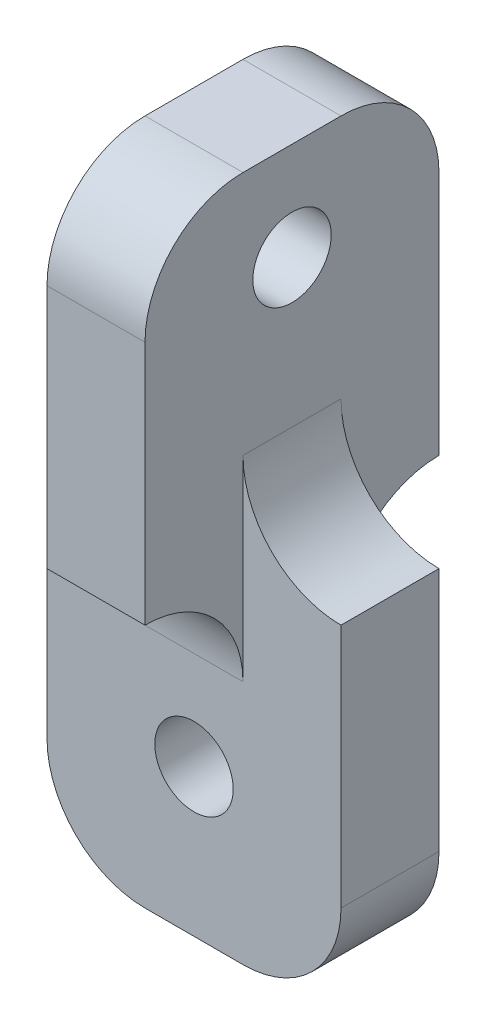
ISO-10303-21;
HEADER;
FILE_DESCRIPTION(('STEP AP214'),'2;1');
FILE_NAME('part.step','',(''),(''),'','','');
FILE_SCHEMA(('AUTOMOTIVE_DESIGN { 1 0 10303 214 1 1 1 1 }'));
ENDSEC;
DATA;
#1=APPLICATION_CONTEXT('core data for automotive mechanical design processes');
#2=APPLICATION_PROTOCOL_DEFINITION('international standard','automotive_design',2000,#1);
#3=PRODUCT_CONTEXT('',#1,'mechanical');
#4=PRODUCT('Part','Part','',(#3));
#5=PRODUCT_RELATED_PRODUCT_CATEGORY('part','',(#4));
#6=PRODUCT_DEFINITION_FORMATION('','',#4);
#7=PRODUCT_DEFINITION_CONTEXT('part definition',#1,'design');
#8=PRODUCT_DEFINITION('design','',#6,#7);
#9=PRODUCT_DEFINITION_SHAPE('','',#8);
#10=(LENGTH_UNIT() NAMED_UNIT(*) SI_UNIT(.MILLI.,.METRE.));
#11=(NAMED_UNIT(*) PLANE_ANGLE_UNIT() SI_UNIT($,.RADIAN.));
#12=(NAMED_UNIT(*) SI_UNIT($,.STERADIAN.) SOLID_ANGLE_UNIT());
#13=UNCERTAINTY_MEASURE_WITH_UNIT(LENGTH_MEASURE(1.E-05),#10,'distance_accuracy_value','');
#14=(GEOMETRIC_REPRESENTATION_CONTEXT(3) GLOBAL_UNCERTAINTY_ASSIGNED_CONTEXT((#13)) GLOBAL_UNIT_ASSIGNED_CONTEXT((#10,
#11,#12)) REPRESENTATION_CONTEXT('',''));
#15=CARTESIAN_POINT('',(0.,0.,0.));
#16=DIRECTION('',(0.,0.,1.));
#17=DIRECTION('',(1.,0.,0.));
#18=AXIS2_PLACEMENT_3D('',#15,#16,#17);
#19=CARTESIAN_POINT('',(-20.,25.,10.));
#20=DIRECTION('',(1.,0.,0.));
#21=DIRECTION('',(0.,0.,-1.));
#22=AXIS2_PLACEMENT_3D('',#19,#20,#21);
#23=CYLINDRICAL_SURFACE('',#22,10.);
#24=DIRECTION('',(-1.,0.,0.));
#25=VECTOR('',#24,1.);
#26=CARTESIAN_POINT('',(-20.,25.,20.));
#27=LINE('',#26,#25);
#28=CARTESIAN_POINT('',(-10.,25.,20.));
#29=VERTEX_POINT('',#28);
#30=CARTESIAN_POINT('',(-20.,25.,20.));
#31=VERTEX_POINT('',#30);
#32=EDGE_CURVE('E219',#29,#31,#27,.T.);
#33=ORIENTED_EDGE('',*,*,#32,.F.);
#34=CARTESIAN_POINT('',(-10.,25.,10.));
#35=DIRECTION('',(-1.,0.,0.));
#36=DIRECTION('',(0.,0.,1.));
#37=AXIS2_PLACEMENT_3D('',#34,#35,#36);
#38=CIRCLE('',#37,10.);
#39=CARTESIAN_POINT('',(-10.,35.,10.));
#40=VERTEX_POINT('',#39);
#41=EDGE_CURVE('E153',#40,#29,#38,.F.);
#42=ORIENTED_EDGE('',*,*,#41,.F.);
#43=DIRECTION('',(-1.,0.,0.));
#44=VECTOR('',#43,1.);
#45=CARTESIAN_POINT('',(-20.,35.,10.));
#46=LINE('',#45,#44);
#47=CARTESIAN_POINT('',(-20.,35.,10.));
#48=VERTEX_POINT('',#47);
#49=EDGE_CURVE('E216',#48,#40,#46,.F.);
#50=ORIENTED_EDGE('',*,*,#49,.F.);
#51=CARTESIAN_POINT('',(-20.,25.,10.));
#52=DIRECTION('',(-1.,0.,0.));
#53=DIRECTION('',(0.,0.,1.));
#54=AXIS2_PLACEMENT_3D('',#51,#52,#53);
#55=CIRCLE('',#54,10.);
#56=EDGE_CURVE('E211',#31,#48,#55,.T.);
#57=ORIENTED_EDGE('',*,*,#56,.F.);
#58=EDGE_LOOP('',(#33,#42,#50,#57));
#59=FACE_BOUND('',#58,.T.);
#60=ADVANCED_FACE('F33',(#59),#23,.T.);
#61=CARTESIAN_POINT('',(-20.,25.,0.));
#62=DIRECTION('',(1.,0.,0.));
#63=DIRECTION('',(0.,0.,-1.));
#64=AXIS2_PLACEMENT_3D('',#61,#62,#63);
#65=CYLINDRICAL_SURFACE('',#64,10.);
#66=DIRECTION('',(1.,0.,0.));
#67=VECTOR('',#66,1.);
#68=CARTESIAN_POINT('',(-20.,25.,-10.));
#69=LINE('',#68,#67);
#70=CARTESIAN_POINT('',(-20.,25.,-10.));
#71=VERTEX_POINT('',#70);
#72=CARTESIAN_POINT('',(-10.,25.,-10.));
#73=VERTEX_POINT('',#72);
#74=EDGE_CURVE('E229',#71,#73,#69,.T.);
#75=ORIENTED_EDGE('',*,*,#74,.F.);
#76=CARTESIAN_POINT('',(-20.,25.,0.));
#77=DIRECTION('',(-1.,0.,0.));
#78=DIRECTION('',(0.,0.,1.));
#79=AXIS2_PLACEMENT_3D('',#76,#77,#78);
#80=CIRCLE('',#79,10.);
#81=CARTESIAN_POINT('',(-20.,35.,0.));
#82=VERTEX_POINT('',#81);
#83=EDGE_CURVE('E224',#82,#71,#80,.T.);
#84=ORIENTED_EDGE('',*,*,#83,.F.);
#85=DIRECTION('',(1.,0.,0.));
#86=VECTOR('',#85,1.);
#87=CARTESIAN_POINT('',(0.,35.,0.));
#88=LINE('',#87,#86);
#89=CARTESIAN_POINT('',(-10.,35.,0.));
#90=VERTEX_POINT('',#89);
#91=EDGE_CURVE('E226',#90,#82,#88,.F.);
#92=ORIENTED_EDGE('',*,*,#91,.F.);
#93=CARTESIAN_POINT('',(-10.,25.,0.));
#94=DIRECTION('',(-1.,0.,0.));
#95=DIRECTION('',(0.,0.,1.));
#96=AXIS2_PLACEMENT_3D('',#93,#94,#95);
#97=CIRCLE('',#96,10.);
#98=EDGE_CURVE('E221',#73,#90,#97,.F.);
#99=ORIENTED_EDGE('',*,*,#98,.F.);
#100=EDGE_LOOP('',(#75,#84,#92,#99));
#101=FACE_BOUND('',#100,.T.);
#102=ADVANCED_FACE('F309',(#101),#65,.T.);
#103=CARTESIAN_POINT('',(-10.,-25.,10.));
#104=DIRECTION('',(0.,0.,1.));
#105=DIRECTION('',(1.,0.,0.));
#106=AXIS2_PLACEMENT_3D('',#103,#104,#105);
#107=CYLINDRICAL_SURFACE('',#106,10.);
#108=DIRECTION('',(0.,0.,1.));
#109=VECTOR('',#108,1.);
#110=CARTESIAN_POINT('',(-10.,-35.,10.));
#111=LINE('',#110,#109);
#112=CARTESIAN_POINT('',(-9.99999999999999,-35.,0.));
#113=VERTEX_POINT('',#112);
#114=CARTESIAN_POINT('',(-9.99999999999999,-35.,10.));
#115=VERTEX_POINT('',#114);
#116=EDGE_CURVE('E242',#113,#115,#111,.T.);
#117=ORIENTED_EDGE('',*,*,#116,.F.);
#118=CARTESIAN_POINT('',(-10.,-25.,0.));
#119=DIRECTION('',(0.,0.,-1.));
#120=DIRECTION('',(-1.,0.,0.));
#121=AXIS2_PLACEMENT_3D('',#118,#119,#120);
#122=CIRCLE('',#121,10.);
#123=CARTESIAN_POINT('',(0.,-25.,0.));
#124=VERTEX_POINT('',#123);
#125=EDGE_CURVE('E237',#124,#113,#122,.T.);
#126=ORIENTED_EDGE('',*,*,#125,.F.);
#127=DIRECTION('',(0.,0.,1.));
#128=VECTOR('',#127,1.);
#129=CARTESIAN_POINT('',(0.,-25.,10.));
#130=LINE('',#129,#128);
#131=CARTESIAN_POINT('',(0.,-25.,10.));
#132=VERTEX_POINT('',#131);
#133=EDGE_CURVE('E239',#132,#124,#130,.F.);
#134=ORIENTED_EDGE('',*,*,#133,.F.);
#135=CARTESIAN_POINT('',(-10.,-25.,10.));
#136=DIRECTION('',(0.,0.,-1.));
#137=DIRECTION('',(-1.,0.,0.));
#138=AXIS2_PLACEMENT_3D('',#135,#136,#137);
#139=CIRCLE('',#138,10.);
#140=EDGE_CURVE('E232',#115,#132,#139,.F.);
#141=ORIENTED_EDGE('',*,*,#140,.F.);
#142=EDGE_LOOP('',(#117,#126,#134,#141));
#143=FACE_BOUND('',#142,.T.);
#144=ADVANCED_FACE('F315',(#143),#107,.T.);
#145=CARTESIAN_POINT('',(-20.,-25.,10.));
#146=DIRECTION('',(0.,0.,1.));
#147=DIRECTION('',(1.,0.,0.));
#148=AXIS2_PLACEMENT_3D('',#145,#146,#147);
#149=CYLINDRICAL_SURFACE('',#148,10.);
#150=DIRECTION('',(0.,0.,-1.));
#151=VECTOR('',#150,1.);
#152=CARTESIAN_POINT('',(-20.,-35.,10.));
#153=LINE('',#152,#151);
#154=CARTESIAN_POINT('',(-20.,-35.,10.));
#155=VERTEX_POINT('',#154);
#156=CARTESIAN_POINT('',(-20.,-35.,0.));
#157=VERTEX_POINT('',#156);
#158=EDGE_CURVE('E253',#155,#157,#153,.T.);
#159=ORIENTED_EDGE('',*,*,#158,.F.);
#160=CARTESIAN_POINT('',(-20.,-25.,10.));
#161=DIRECTION('',(0.,0.,-1.));
#162=DIRECTION('',(-1.,0.,0.));
#163=AXIS2_PLACEMENT_3D('',#160,#161,#162);
#164=CIRCLE('',#163,10.);
#165=CARTESIAN_POINT('',(-30.,-25.,10.));
#166=VERTEX_POINT('',#165);
#167=EDGE_CURVE('E247',#166,#155,#164,.F.);
#168=ORIENTED_EDGE('',*,*,#167,.F.);
#169=DIRECTION('',(0.,0.,-1.));
#170=VECTOR('',#169,1.);
#171=CARTESIAN_POINT('',(-30.,-25.,10.));
#172=LINE('',#171,#170);
#173=CARTESIAN_POINT('',(-30.,-25.,0.));
#174=VERTEX_POINT('',#173);
#175=EDGE_CURVE('E250',#174,#166,#172,.F.);
#176=ORIENTED_EDGE('',*,*,#175,.F.);
#177=CARTESIAN_POINT('',(-20.,-25.,0.));
#178=DIRECTION('',(0.,0.,-1.));
#179=DIRECTION('',(-1.,0.,0.));
#180=AXIS2_PLACEMENT_3D('',#177,#178,#179);
#181=CIRCLE('',#180,10.);
#182=EDGE_CURVE('E245',#157,#174,#181,.T.);
#183=ORIENTED_EDGE('',*,*,#182,.F.);
#184=EDGE_LOOP('',(#159,#168,#176,#183));
#185=FACE_BOUND('',#184,.T.);
#186=ADVANCED_FACE('F392',(#185),#149,.T.);
#187=CARTESIAN_POINT('',(0.,0.,10.));
#188=DIRECTION('',(1.,0.,0.));
#189=DIRECTION('',(0.,1.,0.));
#190=AXIS2_PLACEMENT_3D('',#187,#188,#189);
#191=PLANE('',#190);
#192=DIRECTION('',(0.,-1.,0.));
#193=VECTOR('',#192,1.);
#194=CARTESIAN_POINT('',(0.,0.,10.));
#195=LINE('',#194,#193);
#196=CARTESIAN_POINT('',(0.,0.,10.));
#197=VERTEX_POINT('',#196);
#198=EDGE_CURVE('E263',#197,#132,#195,.T.);
#199=ORIENTED_EDGE('',*,*,#198,.T.);
#200=ORIENTED_EDGE('',*,*,#133,.T.);
#201=DIRECTION('',(0.,-1.,0.));
#202=VECTOR('',#201,1.);
#203=CARTESIAN_POINT('',(0.,0.,0.));
#204=LINE('',#203,#202);
#205=CARTESIAN_POINT('',(0.,0.,0.));
#206=VERTEX_POINT('',#205);
#207=EDGE_CURVE('E266',#206,#124,#204,.T.);
#208=ORIENTED_EDGE('',*,*,#207,.F.);
#209=DIRECTION('',(0.,0.,-1.));
#210=VECTOR('',#209,1.);
#211=CARTESIAN_POINT('',(0.,0.,10.));
#212=LINE('',#211,#210);
#213=EDGE_CURVE('E256',#197,#206,#212,.T.);
#214=ORIENTED_EDGE('',*,*,#213,.F.);
#215=EDGE_LOOP('',(#199,#200,#208,#214));
#216=FACE_BOUND('',#215,.T.);
#217=ADVANCED_FACE('F338',(#216),#191,.T.);
#218=CARTESIAN_POINT('',(-30.,0.,10.));
#219=DIRECTION('',(1.,0.,0.));
#220=DIRECTION('',(0.,1.,0.));
#221=AXIS2_PLACEMENT_3D('',#218,#219,#220);
#222=PLANE('',#221);
#223=DIRECTION('',(0.,-1.,0.));
#224=VECTOR('',#223,1.);
#225=CARTESIAN_POINT('',(-30.,0.,0.));
#226=LINE('',#225,#224);
#227=CARTESIAN_POINT('',(-30.,0.,0.));
#228=VERTEX_POINT('',#227);
#229=EDGE_CURVE('E202',#228,#174,#226,.T.);
#230=ORIENTED_EDGE('',*,*,#229,.T.);
#231=ORIENTED_EDGE('',*,*,#175,.T.);
#232=DIRECTION('',(0.,-1.,0.));
#233=VECTOR('',#232,1.);
#234=CARTESIAN_POINT('',(-30.,0.,10.));
#235=LINE('',#234,#233);
#236=CARTESIAN_POINT('',(-30.,0.,10.));
#237=VERTEX_POINT('',#236);
#238=EDGE_CURVE('E259',#237,#166,#235,.T.);
#239=ORIENTED_EDGE('',*,*,#238,.F.);
#240=DIRECTION('',(0.,0.,-1.));
#241=VECTOR('',#240,1.);
#242=CARTESIAN_POINT('',(-30.,0.,10.));
#243=LINE('',#242,#241);
#244=EDGE_CURVE('E257',#237,#228,#243,.T.);
#245=ORIENTED_EDGE('',*,*,#244,.T.);
#246=EDGE_LOOP('',(#230,#231,#239,#245));
#247=FACE_BOUND('',#246,.T.);
#248=ADVANCED_FACE('F391',(#247),#222,.F.);
#249=CARTESIAN_POINT('',(0.,-35.,10.));
#250=DIRECTION('',(0.,-1.,0.));
#251=DIRECTION('',(0.,0.,-1.));
#252=AXIS2_PLACEMENT_3D('',#249,#250,#251);
#253=PLANE('',#252);
#254=DIRECTION('',(-1.,0.,0.));
#255=VECTOR('',#254,1.);
#256=CARTESIAN_POINT('',(0.,-35.,0.));
#257=LINE('',#256,#255);
#258=EDGE_CURVE('E264',#113,#157,#257,.T.);
#259=ORIENTED_EDGE('',*,*,#258,.F.);
#260=ORIENTED_EDGE('',*,*,#116,.T.);
#261=DIRECTION('',(-1.,0.,0.));
#262=VECTOR('',#261,1.);
#263=CARTESIAN_POINT('',(0.,-35.,10.));
#264=LINE('',#263,#262);
#265=EDGE_CURVE('E272',#115,#155,#264,.T.);
#266=ORIENTED_EDGE('',*,*,#265,.T.);
#267=ORIENTED_EDGE('',*,*,#158,.T.);
#268=EDGE_LOOP('',(#259,#260,#266,#267));
#269=FACE_BOUND('',#268,.T.);
#270=ADVANCED_FACE('F411',(#269),#253,.T.);
#271=CARTESIAN_POINT('',(0.,0.,10.));
#272=DIRECTION('',(0.,0.,-1.));
#273=DIRECTION('',(-1.,0.,0.));
#274=AXIS2_PLACEMENT_3D('',#271,#272,#273);
#275=PLANE('',#274);
#276=CARTESIAN_POINT('',(-15.,-20.,10.));
#277=DIRECTION('',(0.,0.,-1.));
#278=DIRECTION('',(-1.,0.,0.));
#279=AXIS2_PLACEMENT_3D('',#276,#277,#278);
#280=CIRCLE('',#279,4.);
#281=CARTESIAN_POINT('',(-19.,-20.,10.));
#282=VERTEX_POINT('',#281);
#283=EDGE_CURVE('E269',#282,#282,#280,.F.);
#284=ORIENTED_EDGE('',*,*,#283,.F.);
#285=EDGE_LOOP('',(#284));
#286=FACE_BOUND('',#285,.T.);
#287=DIRECTION('',(-1.,0.,0.));
#288=VECTOR('',#287,1.);
#289=CARTESIAN_POINT('',(-20.,-10.,10.));
#290=LINE('',#289,#288);
#291=CARTESIAN_POINT('',(-10.,-10.,10.));
#292=VERTEX_POINT('',#291);
#293=CARTESIAN_POINT('',(-20.,-10.,10.));
#294=VERTEX_POINT('',#293);
#295=EDGE_CURVE('E172',#292,#294,#290,.T.);
#296=ORIENTED_EDGE('',*,*,#295,.T.);
#297=DIRECTION('',(0.,1.,0.));
#298=VECTOR('',#297,1.);
#299=CARTESIAN_POINT('',(-20.,0.,10.));
#300=LINE('',#299,#298);
#301=CARTESIAN_POINT('',(-20.,10.,10.));
#302=VERTEX_POINT('',#301);
#303=EDGE_CURVE('E55',#294,#302,#300,.T.);
#304=ORIENTED_EDGE('',*,*,#303,.T.);
#305=CARTESIAN_POINT('',(-30.,10.,10.));
#306=DIRECTION('',(0.,0.,-1.));
#307=DIRECTION('',(-1.,0.,0.));
#308=AXIS2_PLACEMENT_3D('',#305,#306,#307);
#309=CIRCLE('',#308,10.);
#310=EDGE_CURVE('E11',#302,#237,#309,.T.);
#311=ORIENTED_EDGE('',*,*,#310,.T.);
#312=ORIENTED_EDGE('',*,*,#238,.T.);
#313=ORIENTED_EDGE('',*,*,#167,.T.);
#314=ORIENTED_EDGE('',*,*,#265,.F.);
#315=ORIENTED_EDGE('',*,*,#140,.T.);
#316=ORIENTED_EDGE('',*,*,#198,.F.);
#317=CARTESIAN_POINT('',(0.,10.,10.));
#318=DIRECTION('',(0.,0.,-1.));
#319=DIRECTION('',(-1.,0.,0.));
#320=AXIS2_PLACEMENT_3D('',#317,#318,#319);
#321=CIRCLE('',#320,10.);
#322=CARTESIAN_POINT('',(-10.,10.,10.));
#323=VERTEX_POINT('',#322);
#324=EDGE_CURVE('E192',#197,#323,#321,.T.);
#325=ORIENTED_EDGE('',*,*,#324,.T.);
#326=DIRECTION('',(0.,-1.,0.));
#327=VECTOR('',#326,1.);
#328=CARTESIAN_POINT('',(-10.,35.,10.));
#329=LINE('',#328,#327);
#330=EDGE_CURVE('E209',#323,#292,#329,.T.);
#331=ORIENTED_EDGE('',*,*,#330,.T.);
#332=EDGE_LOOP('',(#296,#304,#311,#312,#313,#314,#315,#316,#325,#331));
#333=FACE_BOUND('',#332,.T.);
#334=ADVANCED_FACE('F208',(#286,#333),#275,.F.);
#335=CARTESIAN_POINT('',(0.,0.,0.));
#336=DIRECTION('',(0.,0.,-1.));
#337=DIRECTION('',(-1.,0.,0.));
#338=AXIS2_PLACEMENT_3D('',#335,#336,#337);
#339=PLANE('',#338);
#340=CARTESIAN_POINT('',(-15.,-20.,0.));
#341=DIRECTION('',(0.,0.,1.));
#342=DIRECTION('',(1.,0.,0.));
#343=AXIS2_PLACEMENT_3D('',#340,#341,#342);
#344=CIRCLE('',#343,4.);
#345=CARTESIAN_POINT('',(-11.,-20.,0.));
#346=VERTEX_POINT('',#345);
#347=EDGE_CURVE('E157',#346,#346,#344,.T.);
#348=ORIENTED_EDGE('',*,*,#347,.T.);
#349=EDGE_LOOP('',(#348));
#350=FACE_BOUND('',#349,.T.);
#351=ORIENTED_EDGE('',*,*,#229,.F.);
#352=CARTESIAN_POINT('',(-30.,10.,0.));
#353=DIRECTION('',(0.,0.,-1.));
#354=DIRECTION('',(-1.,0.,0.));
#355=AXIS2_PLACEMENT_3D('',#352,#353,#354);
#356=CIRCLE('',#355,10.);
#357=CARTESIAN_POINT('',(-20.,10.,0.));
#358=VERTEX_POINT('',#357);
#359=EDGE_CURVE('E41',#228,#358,#356,.F.);
#360=ORIENTED_EDGE('',*,*,#359,.T.);
#361=DIRECTION('',(0.,-1.,0.));
#362=VECTOR('',#361,1.);
#363=CARTESIAN_POINT('',(-20.,35.,0.));
#364=LINE('',#363,#362);
#365=CARTESIAN_POINT('',(-20.,-10.,0.));
#366=VERTEX_POINT('',#365);
#367=EDGE_CURVE('E48',#358,#366,#364,.T.);
#368=ORIENTED_EDGE('',*,*,#367,.T.);
#369=DIRECTION('',(-1.,0.,0.));
#370=VECTOR('',#369,1.);
#371=CARTESIAN_POINT('',(0.,-10.,0.));
#372=LINE('',#371,#370);
#373=CARTESIAN_POINT('',(-10.,-10.,0.));
#374=VERTEX_POINT('',#373);
#375=EDGE_CURVE('E176',#366,#374,#372,.F.);
#376=ORIENTED_EDGE('',*,*,#375,.T.);
#377=DIRECTION('',(0.,1.,0.));
#378=VECTOR('',#377,1.);
#379=CARTESIAN_POINT('',(-10.,0.,0.));
#380=LINE('',#379,#378);
#381=CARTESIAN_POINT('',(-10.,10.,0.));
#382=VERTEX_POINT('',#381);
#383=EDGE_CURVE('E173',#374,#382,#380,.T.);
#384=ORIENTED_EDGE('',*,*,#383,.T.);
#385=CARTESIAN_POINT('',(0.,10.,0.));
#386=DIRECTION('',(0.,0.,-1.));
#387=DIRECTION('',(-1.,0.,0.));
#388=AXIS2_PLACEMENT_3D('',#385,#386,#387);
#389=CIRCLE('',#388,10.);
#390=EDGE_CURVE('E190',#382,#206,#389,.F.);
#391=ORIENTED_EDGE('',*,*,#390,.T.);
#392=ORIENTED_EDGE('',*,*,#207,.T.);
#393=ORIENTED_EDGE('',*,*,#125,.T.);
#394=ORIENTED_EDGE('',*,*,#258,.T.);
#395=ORIENTED_EDGE('',*,*,#182,.T.);
#396=EDGE_LOOP('',(#351,#360,#368,#376,#384,#391,#392,#393,#394,#395));
#397=FACE_BOUND('',#396,.T.);
#398=ADVANCED_FACE('F199',(#350,#397),#339,.T.);
#399=CARTESIAN_POINT('',(-15.,-20.,14.));
#400=DIRECTION('',(0.,0.,-1.));
#401=DIRECTION('',(-1.,0.,0.));
#402=AXIS2_PLACEMENT_3D('',#399,#400,#401);
#403=CYLINDRICAL_SURFACE('',#402,4.);
#404=ORIENTED_EDGE('',*,*,#347,.F.);
#405=EDGE_LOOP('',(#404));
#406=FACE_BOUND('',#405,.T.);
#407=ORIENTED_EDGE('',*,*,#283,.T.);
#408=EDGE_LOOP('',(#407));
#409=FACE_BOUND('',#408,.T.);
#410=ADVANCED_FACE('F306',(#406,#409),#403,.F.);
#411=CARTESIAN_POINT('',(-20.,35.,20.));
#412=DIRECTION('',(0.,0.,-1.));
#413=DIRECTION('',(-1.,0.,0.));
#414=AXIS2_PLACEMENT_3D('',#411,#412,#413);
#415=PLANE('',#414);
#416=DIRECTION('',(0.,-1.,0.));
#417=VECTOR('',#416,1.);
#418=CARTESIAN_POINT('',(-10.,35.,20.));
#419=LINE('',#418,#417);
#420=CARTESIAN_POINT('',(-10.,0.,20.));
#421=VERTEX_POINT('',#420);
#422=EDGE_CURVE('E145',#29,#421,#419,.T.);
#423=ORIENTED_EDGE('',*,*,#422,.F.);
#424=ORIENTED_EDGE('',*,*,#32,.T.);
#425=DIRECTION('',(0.,-1.,0.));
#426=VECTOR('',#425,1.);
#427=CARTESIAN_POINT('',(-20.,35.,20.));
#428=LINE('',#427,#426);
#429=CARTESIAN_POINT('',(-20.,0.,20.));
#430=VERTEX_POINT('',#429);
#431=EDGE_CURVE('E165',#31,#430,#428,.T.);
#432=ORIENTED_EDGE('',*,*,#431,.T.);
#433=DIRECTION('',(1.,0.,0.));
#434=VECTOR('',#433,1.);
#435=CARTESIAN_POINT('',(-20.,0.,20.));
#436=LINE('',#435,#434);
#437=EDGE_CURVE('E162',#430,#421,#436,.T.);
#438=ORIENTED_EDGE('',*,*,#437,.T.);
#439=EDGE_LOOP('',(#423,#424,#432,#438));
#440=FACE_BOUND('',#439,.T.);
#441=ADVANCED_FACE('F163',(#440),#415,.F.);
#442=CARTESIAN_POINT('',(-10.,35.,20.));
#443=DIRECTION('',(-1.,0.,0.));
#444=DIRECTION('',(0.,0.,1.));
#445=AXIS2_PLACEMENT_3D('',#442,#443,#444);
#446=PLANE('',#445);
#447=CARTESIAN_POINT('',(-10.,25.,5.));
#448=DIRECTION('',(1.,0.,0.));
#449=DIRECTION('',(0.,0.,-1.));
#450=AXIS2_PLACEMENT_3D('',#447,#448,#449);
#451=CIRCLE('',#450,4.);
#452=CARTESIAN_POINT('',(-10.,25.,1.));
#453=VERTEX_POINT('',#452);
#454=EDGE_CURVE('E235',#453,#453,#451,.T.);
#455=ORIENTED_EDGE('',*,*,#454,.F.);
#456=EDGE_LOOP('',(#455));
#457=FACE_BOUND('',#456,.T.);
#458=DIRECTION('',(0.,0.,-1.));
#459=VECTOR('',#458,1.);
#460=CARTESIAN_POINT('',(-10.,10.,0.));
#461=LINE('',#460,#459);
#462=EDGE_CURVE('E188',#323,#382,#461,.T.);
#463=ORIENTED_EDGE('',*,*,#462,.T.);
#464=ORIENTED_EDGE('',*,*,#383,.F.);
#465=CARTESIAN_POINT('',(-10.,-10.,-10.));
#466=DIRECTION('',(-1.,0.,0.));
#467=DIRECTION('',(0.,0.,1.));
#468=AXIS2_PLACEMENT_3D('',#465,#466,#467);
#469=CIRCLE('',#468,10.);
#470=CARTESIAN_POINT('',(-10.,0.,-10.));
#471=VERTEX_POINT('',#470);
#472=EDGE_CURVE('E186',#374,#471,#469,.T.);
#473=ORIENTED_EDGE('',*,*,#472,.T.);
#474=DIRECTION('',(0.,-1.,0.));
#475=VECTOR('',#474,1.);
#476=CARTESIAN_POINT('',(-10.,35.,-10.));
#477=LINE('',#476,#475);
#478=EDGE_CURVE('E158',#73,#471,#477,.T.);
#479=ORIENTED_EDGE('',*,*,#478,.F.);
#480=ORIENTED_EDGE('',*,*,#98,.T.);
#481=DIRECTION('',(0.,0.,-1.));
#482=VECTOR('',#481,1.);
#483=CARTESIAN_POINT('',(-10.,35.,20.));
#484=LINE('',#483,#482);
#485=EDGE_CURVE('E288',#40,#90,#484,.T.);
#486=ORIENTED_EDGE('',*,*,#485,.F.);
#487=ORIENTED_EDGE('',*,*,#41,.T.);
#488=ORIENTED_EDGE('',*,*,#422,.T.);
#489=CARTESIAN_POINT('',(-10.,-10.,20.));
#490=DIRECTION('',(-1.,0.,0.));
#491=DIRECTION('',(0.,0.,1.));
#492=AXIS2_PLACEMENT_3D('',#489,#490,#491);
#493=CIRCLE('',#492,10.);
#494=EDGE_CURVE('E150',#421,#292,#493,.T.);
#495=ORIENTED_EDGE('',*,*,#494,.T.);
#496=ORIENTED_EDGE('',*,*,#330,.F.);
#497=EDGE_LOOP('',(#463,#464,#473,#479,#480,#486,#487,#488,#495,#496));
#498=FACE_BOUND('',#497,.T.);
#499=ADVANCED_FACE('F148',(#457,#498),#446,.F.);
#500=CARTESIAN_POINT('',(-20.,35.,-10.));
#501=DIRECTION('',(0.,0.,-1.));
#502=DIRECTION('',(-1.,0.,0.));
#503=AXIS2_PLACEMENT_3D('',#500,#501,#502);
#504=PLANE('',#503);
#505=DIRECTION('',(0.,-1.,0.));
#506=VECTOR('',#505,1.);
#507=CARTESIAN_POINT('',(-20.,35.,-10.));
#508=LINE('',#507,#506);
#509=CARTESIAN_POINT('',(-20.,0.,-10.));
#510=VERTEX_POINT('',#509);
#511=EDGE_CURVE('E282',#71,#510,#508,.T.);
#512=ORIENTED_EDGE('',*,*,#511,.F.);
#513=ORIENTED_EDGE('',*,*,#74,.T.);
#514=ORIENTED_EDGE('',*,*,#478,.T.);
#515=DIRECTION('',(1.,0.,0.));
#516=VECTOR('',#515,1.);
#517=CARTESIAN_POINT('',(-20.,0.,-10.));
#518=LINE('',#517,#516);
#519=EDGE_CURVE('E167',#510,#471,#518,.T.);
#520=ORIENTED_EDGE('',*,*,#519,.F.);
#521=EDGE_LOOP('',(#512,#513,#514,#520));
#522=FACE_BOUND('',#521,.T.);
#523=ADVANCED_FACE('F298',(#522),#504,.T.);
#524=CARTESIAN_POINT('',(-20.,35.,20.));
#525=DIRECTION('',(-1.,0.,0.));
#526=DIRECTION('',(0.,0.,1.));
#527=AXIS2_PLACEMENT_3D('',#524,#525,#526);
#528=PLANE('',#527);
#529=CARTESIAN_POINT('',(-20.,25.,5.));
#530=DIRECTION('',(-1.,0.,0.));
#531=DIRECTION('',(0.,0.,1.));
#532=AXIS2_PLACEMENT_3D('',#529,#530,#531);
#533=CIRCLE('',#532,4.);
#534=CARTESIAN_POINT('',(-20.,25.,9.));
#535=VERTEX_POINT('',#534);
#536=EDGE_CURVE('E168',#535,#535,#533,.T.);
#537=ORIENTED_EDGE('',*,*,#536,.F.);
#538=EDGE_LOOP('',(#537));
#539=FACE_BOUND('',#538,.T.);
#540=ORIENTED_EDGE('',*,*,#367,.F.);
#541=DIRECTION('',(0.,0.,-1.));
#542=VECTOR('',#541,1.);
#543=CARTESIAN_POINT('',(-20.,10.,20.));
#544=LINE('',#543,#542);
#545=EDGE_CURVE('E195',#358,#302,#544,.F.);
#546=ORIENTED_EDGE('',*,*,#545,.T.);
#547=ORIENTED_EDGE('',*,*,#303,.F.);
#548=CARTESIAN_POINT('',(-20.,-10.,20.));
#549=DIRECTION('',(-1.,0.,0.));
#550=DIRECTION('',(0.,0.,1.));
#551=AXIS2_PLACEMENT_3D('',#548,#549,#550);
#552=CIRCLE('',#551,10.);
#553=EDGE_CURVE('E174',#294,#430,#552,.F.);
#554=ORIENTED_EDGE('',*,*,#553,.T.);
#555=ORIENTED_EDGE('',*,*,#431,.F.);
#556=ORIENTED_EDGE('',*,*,#56,.T.);
#557=DIRECTION('',(0.,0.,-1.));
#558=VECTOR('',#557,1.);
#559=CARTESIAN_POINT('',(-20.,35.,20.));
#560=LINE('',#559,#558);
#561=EDGE_CURVE('E286',#48,#82,#560,.T.);
#562=ORIENTED_EDGE('',*,*,#561,.T.);
#563=ORIENTED_EDGE('',*,*,#83,.T.);
#564=ORIENTED_EDGE('',*,*,#511,.T.);
#565=CARTESIAN_POINT('',(-20.,-10.,-10.));
#566=DIRECTION('',(-1.,0.,0.));
#567=DIRECTION('',(0.,0.,1.));
#568=AXIS2_PLACEMENT_3D('',#565,#566,#567);
#569=CIRCLE('',#568,10.);
#570=EDGE_CURVE('E184',#510,#366,#569,.F.);
#571=ORIENTED_EDGE('',*,*,#570,.T.);
#572=EDGE_LOOP('',(#540,#546,#547,#554,#555,#556,#562,#563,#564,#571));
#573=FACE_BOUND('',#572,.T.);
#574=ADVANCED_FACE('F207',(#539,#573),#528,.T.);
#575=CARTESIAN_POINT('',(0.,35.,0.));
#576=DIRECTION('',(0.,1.,0.));
#577=DIRECTION('',(0.,0.,1.));
#578=AXIS2_PLACEMENT_3D('',#575,#576,#577);
#579=PLANE('',#578);
#580=ORIENTED_EDGE('',*,*,#561,.F.);
#581=ORIENTED_EDGE('',*,*,#49,.T.);
#582=ORIENTED_EDGE('',*,*,#485,.T.);
#583=ORIENTED_EDGE('',*,*,#91,.T.);
#584=EDGE_LOOP('',(#580,#581,#582,#583));
#585=FACE_BOUND('',#584,.T.);
#586=ADVANCED_FACE('F350',(#585),#579,.T.);
#587=CARTESIAN_POINT('',(-45.,25.,5.));
#588=DIRECTION('',(1.,0.,0.));
#589=DIRECTION('',(0.,0.,-1.));
#590=AXIS2_PLACEMENT_3D('',#587,#588,#589);
#591=CYLINDRICAL_SURFACE('',#590,4.);
#592=ORIENTED_EDGE('',*,*,#536,.T.);
#593=EDGE_LOOP('',(#592));
#594=FACE_BOUND('',#593,.T.);
#595=ORIENTED_EDGE('',*,*,#454,.T.);
#596=EDGE_LOOP('',(#595));
#597=FACE_BOUND('',#596,.T.);
#598=ADVANCED_FACE('F295',(#594,#597),#591,.F.);
#599=CARTESIAN_POINT('',(0.,-10.,20.));
#600=DIRECTION('',(1.,0.,0.));
#601=DIRECTION('',(0.,0.,-1.));
#602=AXIS2_PLACEMENT_3D('',#599,#600,#601);
#603=CYLINDRICAL_SURFACE('',#602,10.);
#604=ORIENTED_EDGE('',*,*,#494,.F.);
#605=ORIENTED_EDGE('',*,*,#437,.F.);
#606=ORIENTED_EDGE('',*,*,#553,.F.);
#607=ORIENTED_EDGE('',*,*,#295,.F.);
#608=EDGE_LOOP('',(#604,#605,#606,#607));
#609=FACE_BOUND('',#608,.T.);
#610=ADVANCED_FACE('F171',(#609),#603,.F.);
#611=CARTESIAN_POINT('',(0.,-10.,-10.));
#612=DIRECTION('',(-1.,0.,0.));
#613=DIRECTION('',(0.,0.,1.));
#614=AXIS2_PLACEMENT_3D('',#611,#612,#613);
#615=CYLINDRICAL_SURFACE('',#614,10.);
#616=ORIENTED_EDGE('',*,*,#472,.F.);
#617=ORIENTED_EDGE('',*,*,#375,.F.);
#618=ORIENTED_EDGE('',*,*,#570,.F.);
#619=ORIENTED_EDGE('',*,*,#519,.T.);
#620=EDGE_LOOP('',(#616,#617,#618,#619));
#621=FACE_BOUND('',#620,.T.);
#622=ADVANCED_FACE('F322',(#621),#615,.F.);
#623=CARTESIAN_POINT('',(0.,10.,20.));
#624=DIRECTION('',(0.,0.,1.));
#625=DIRECTION('',(1.,0.,0.));
#626=AXIS2_PLACEMENT_3D('',#623,#624,#625);
#627=CYLINDRICAL_SURFACE('',#626,10.);
#628=ORIENTED_EDGE('',*,*,#324,.F.);
#629=ORIENTED_EDGE('',*,*,#213,.T.);
#630=ORIENTED_EDGE('',*,*,#390,.F.);
#631=ORIENTED_EDGE('',*,*,#462,.F.);
#632=EDGE_LOOP('',(#628,#629,#630,#631));
#633=FACE_BOUND('',#632,.T.);
#634=ADVANCED_FACE('F324',(#633),#627,.F.);
#635=CARTESIAN_POINT('',(-30.,10.,10.));
#636=DIRECTION('',(0.,0.,-1.));
#637=DIRECTION('',(-1.,0.,0.));
#638=AXIS2_PLACEMENT_3D('',#635,#636,#637);
#639=CYLINDRICAL_SURFACE('',#638,10.);
#640=ORIENTED_EDGE('',*,*,#310,.F.);
#641=ORIENTED_EDGE('',*,*,#545,.F.);
#642=ORIENTED_EDGE('',*,*,#359,.F.);
#643=ORIENTED_EDGE('',*,*,#244,.F.);
#644=EDGE_LOOP('',(#640,#641,#642,#643));
#645=FACE_BOUND('',#644,.T.);
#646=ADVANCED_FACE('F35',(#645),#639,.F.);
#647=CLOSED_SHELL('',(#60,#102,#144,#186,#217,#248,#270,#334,#398,#410,#441,#499,#523,#574,#586,
#598,#610,#622,#634,#646));
#648=MANIFOLD_SOLID_BREP('B2',#647);
#649=ADVANCED_BREP_SHAPE_REPRESENTATION('',(#18,#648),#14);
#650=SHAPE_DEFINITION_REPRESENTATION(#9,#649);
ENDSEC;
END-ISO-10303-21;
